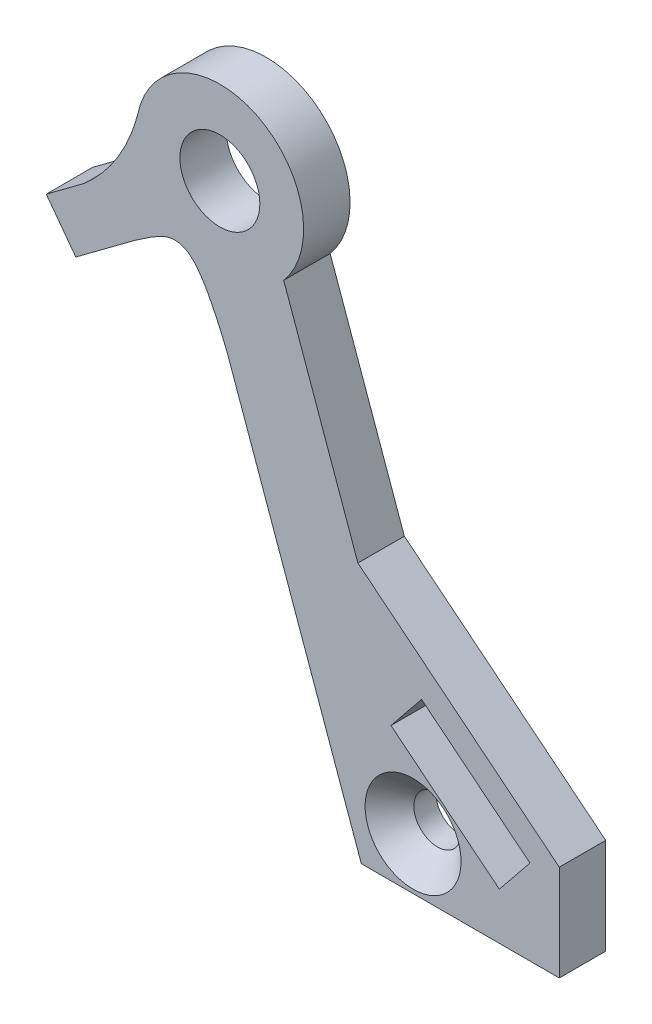
ISO-10303-21;
HEADER;
FILE_DESCRIPTION(('STEP AP214'),'2;1');
FILE_NAME('part.step','',(''),(''),'','','');
FILE_SCHEMA(('AUTOMOTIVE_DESIGN { 1 0 10303 214 1 1 1 1 }'));
ENDSEC;
DATA;
#1=APPLICATION_CONTEXT('core data for automotive mechanical design processes');
#2=APPLICATION_PROTOCOL_DEFINITION('international standard','automotive_design',2000,#1);
#3=PRODUCT_CONTEXT('',#1,'mechanical');
#4=PRODUCT('Part','Part','',(#3));
#5=PRODUCT_RELATED_PRODUCT_CATEGORY('part','',(#4));
#6=PRODUCT_DEFINITION_FORMATION('','',#4);
#7=PRODUCT_DEFINITION_CONTEXT('part definition',#1,'design');
#8=PRODUCT_DEFINITION('design','',#6,#7);
#9=PRODUCT_DEFINITION_SHAPE('','',#8);
#10=(LENGTH_UNIT() NAMED_UNIT(*) SI_UNIT(.MILLI.,.METRE.));
#11=(NAMED_UNIT(*) PLANE_ANGLE_UNIT() SI_UNIT($,.RADIAN.));
#12=(NAMED_UNIT(*) SI_UNIT($,.STERADIAN.) SOLID_ANGLE_UNIT());
#13=UNCERTAINTY_MEASURE_WITH_UNIT(LENGTH_MEASURE(1.E-05),#10,'distance_accuracy_value','');
#14=(GEOMETRIC_REPRESENTATION_CONTEXT(3) GLOBAL_UNCERTAINTY_ASSIGNED_CONTEXT((#13)) GLOBAL_UNIT_ASSIGNED_CONTEXT((#10,
#11,#12)) REPRESENTATION_CONTEXT('',''));
#15=CARTESIAN_POINT('',(0.,0.,0.));
#16=DIRECTION('',(0.,0.,1.));
#17=DIRECTION('',(1.,0.,0.));
#18=AXIS2_PLACEMENT_3D('',#15,#16,#17);
#19=CARTESIAN_POINT('',(7.09605122151095,8.7855872266326,3.05));
#20=DIRECTION('',(0.628337107087621,0.777941180203721,0.));
#21=DIRECTION('',(-0.777941180203721,0.628337107087621,0.));
#22=AXIS2_PLACEMENT_3D('',#19,#20,#21);
#23=PLANE('',#22);
#24=DIRECTION('',(0.777941180203722,-0.628337107087621,0.));
#25=VECTOR('',#24,1.);
#26=CARTESIAN_POINT('',(7.09605122151095,8.7855872266326,0.));
#27=LINE('',#26,#25);
#28=CARTESIAN_POINT('',(3.95568575976615,11.3220362534265,0.));
#29=VERTEX_POINT('',#28);
#30=CARTESIAN_POINT('',(11.0738475586302,5.57275172357473,0.));
#31=VERTEX_POINT('',#30);
#32=EDGE_CURVE('E250',#29,#31,#27,.T.);
#33=ORIENTED_EDGE('',*,*,#32,.T.);
#34=DIRECTION('',(0.,0.,-1.));
#35=VECTOR('',#34,1.);
#36=CARTESIAN_POINT('',(11.0738475586302,5.57275172357473,3.05));
#37=LINE('',#36,#35);
#38=CARTESIAN_POINT('',(11.0738475586302,5.57275172357473,3.05));
#39=VERTEX_POINT('',#38);
#40=EDGE_CURVE('E11',#39,#31,#37,.T.);
#41=ORIENTED_EDGE('',*,*,#40,.F.);
#42=DIRECTION('',(0.777941180203722,-0.628337107087621,0.));
#43=VECTOR('',#42,1.);
#44=CARTESIAN_POINT('',(7.09605122151095,8.7855872266326,3.05));
#45=LINE('',#44,#43);
#46=CARTESIAN_POINT('',(3.95568575976615,11.3220362534265,3.05));
#47=VERTEX_POINT('',#46);
#48=EDGE_CURVE('E180',#47,#39,#45,.T.);
#49=ORIENTED_EDGE('',*,*,#48,.F.);
#50=DIRECTION('',(0.,0.,-1.));
#51=VECTOR('',#50,1.);
#52=CARTESIAN_POINT('',(3.95568575976615,11.3220362534265,3.05));
#53=LINE('',#52,#51);
#54=EDGE_CURVE('E261',#47,#29,#53,.T.);
#55=ORIENTED_EDGE('',*,*,#54,.T.);
#56=EDGE_LOOP('',(#33,#41,#49,#55));
#57=FACE_BOUND('',#56,.T.);
#58=ADVANCED_FACE('F45',(#57),#23,.F.);
#59=CARTESIAN_POINT('',(3.97779633711926,-3.21283550305786,3.05));
#60=DIRECTION('',(-0.777941180203721,0.628337107087621,0.));
#61=DIRECTION('',(-0.628337107087621,-0.777941180203721,0.));
#62=AXIS2_PLACEMENT_3D('',#59,#60,#61);
#63=PLANE('',#62);
#64=DIRECTION('',(0.628337107087621,0.777941180203721,0.));
#65=VECTOR('',#64,1.);
#66=CARTESIAN_POINT('',(3.97779633711926,-3.21283550305786,0.));
#67=LINE('',#66,#65);
#68=CARTESIAN_POINT('',(9.06316881594982,3.08333994692283,0.));
#69=VERTEX_POINT('',#68);
#70=EDGE_CURVE('E170',#69,#31,#67,.T.);
#71=ORIENTED_EDGE('',*,*,#70,.F.);
#72=DIRECTION('',(0.,0.,-1.));
#73=VECTOR('',#72,1.);
#74=CARTESIAN_POINT('',(9.06316881594982,3.08333994692283,3.05));
#75=LINE('',#74,#73);
#76=CARTESIAN_POINT('',(9.06316881594982,3.08333994692283,3.05));
#77=VERTEX_POINT('',#76);
#78=EDGE_CURVE('E56',#77,#69,#75,.T.);
#79=ORIENTED_EDGE('',*,*,#78,.F.);
#80=DIRECTION('',(0.628337107087621,0.777941180203721,0.));
#81=VECTOR('',#80,1.);
#82=CARTESIAN_POINT('',(3.97779633711926,-3.21283550305786,3.05));
#83=LINE('',#82,#81);
#84=EDGE_CURVE('E168',#77,#39,#83,.T.);
#85=ORIENTED_EDGE('',*,*,#84,.T.);
#86=ORIENTED_EDGE('',*,*,#40,.T.);
#87=EDGE_LOOP('',(#71,#79,#85,#86));
#88=FACE_BOUND('',#87,.T.);
#89=ADVANCED_FACE('F166',(#88),#63,.T.);
#90=CARTESIAN_POINT('',(5.08537247883056,6.29617544998069,3.05));
#91=DIRECTION('',(-0.628337107087621,-0.777941180203721,0.));
#92=DIRECTION('',(0.777941180203722,-0.628337107087621,0.));
#93=AXIS2_PLACEMENT_3D('',#90,#91,#92);
#94=PLANE('',#93);
#95=DIRECTION('',(-0.777941180203722,0.628337107087621,0.));
#96=VECTOR('',#95,1.);
#97=CARTESIAN_POINT('',(5.08537247883056,6.29617544998069,0.));
#98=LINE('',#97,#96);
#99=CARTESIAN_POINT('',(1.94500701708577,8.83262447677456,0.));
#100=VERTEX_POINT('',#99);
#101=EDGE_CURVE('E113',#69,#100,#98,.T.);
#102=ORIENTED_EDGE('',*,*,#101,.T.);
#103=DIRECTION('',(0.,0.,-1.));
#104=VECTOR('',#103,1.);
#105=CARTESIAN_POINT('',(1.94500701708577,8.83262447677456,3.05));
#106=LINE('',#105,#104);
#107=CARTESIAN_POINT('',(1.94500701708577,8.83262447677456,3.05));
#108=VERTEX_POINT('',#107);
#109=EDGE_CURVE('E172',#108,#100,#106,.T.);
#110=ORIENTED_EDGE('',*,*,#109,.F.);
#111=DIRECTION('',(-0.777941180203722,0.628337107087621,0.));
#112=VECTOR('',#111,1.);
#113=CARTESIAN_POINT('',(5.08537247883056,6.29617544998069,3.05));
#114=LINE('',#113,#112);
#115=EDGE_CURVE('E174',#77,#108,#114,.T.);
#116=ORIENTED_EDGE('',*,*,#115,.F.);
#117=ORIENTED_EDGE('',*,*,#78,.T.);
#118=EDGE_LOOP('',(#102,#110,#116,#117));
#119=FACE_BOUND('',#118,.T.);
#120=ADVANCED_FACE('F175',(#119),#94,.F.);
#121=CARTESIAN_POINT('',(-9.28819898034565,34.1898082734565,3.05));
#122=DIRECTION('',(0.,0.,-1.));
#123=DIRECTION('',(-1.,0.,0.));
#124=AXIS2_PLACEMENT_3D('',#121,#122,#123);
#125=CYLINDRICAL_SURFACE('',#124,5.5);
#126=CARTESIAN_POINT('',(-9.28819898034565,34.1898082734565,0.));
#127=DIRECTION('',(0.,0.,1.));
#128=DIRECTION('',(1.,0.,0.));
#129=AXIS2_PLACEMENT_3D('',#126,#127,#128);
#130=CIRCLE('',#129,5.5);
#131=CARTESIAN_POINT('',(-5.09661231487709,30.6288250909821,0.));
#132=VERTEX_POINT('',#131);
#133=CARTESIAN_POINT('',(-14.6691492827131,35.3279531866604,0.));
#134=VERTEX_POINT('',#133);
#135=EDGE_CURVE('E196',#132,#134,#130,.T.);
#136=ORIENTED_EDGE('',*,*,#135,.T.);
#137=DIRECTION('',(0.,0.,-1.));
#138=VECTOR('',#137,1.);
#139=CARTESIAN_POINT('',(-14.6691492827131,35.3279531866604,3.05));
#140=LINE('',#139,#138);
#141=CARTESIAN_POINT('',(-14.6691492827131,35.3279531866604,3.05));
#142=VERTEX_POINT('',#141);
#143=EDGE_CURVE('E49',#142,#134,#140,.T.);
#144=ORIENTED_EDGE('',*,*,#143,.F.);
#145=CARTESIAN_POINT('',(-9.28819898034565,34.1898082734565,3.05));
#146=DIRECTION('',(0.,0.,1.));
#147=DIRECTION('',(1.,0.,0.));
#148=AXIS2_PLACEMENT_3D('',#145,#146,#147);
#149=CIRCLE('',#148,5.5);
#150=CARTESIAN_POINT('',(-5.09661231487709,30.6288250909821,3.05));
#151=VERTEX_POINT('',#150);
#152=EDGE_CURVE('E128',#151,#142,#149,.T.);
#153=ORIENTED_EDGE('',*,*,#152,.F.);
#154=DIRECTION('',(0.,0.,-1.));
#155=VECTOR('',#154,1.);
#156=CARTESIAN_POINT('',(-5.09661231487709,30.6288250909821,3.05));
#157=LINE('',#156,#155);
#158=EDGE_CURVE('E191',#151,#132,#157,.T.);
#159=ORIENTED_EDGE('',*,*,#158,.T.);
#160=EDGE_LOOP('',(#136,#144,#153,#159));
#161=FACE_BOUND('',#160,.T.);
#162=ADVANCED_FACE('F305',(#161),#125,.T.);
#163=CARTESIAN_POINT('',(-18.2360742486272,29.5577827751236,3.05));
#164=CARTESIAN_POINT('',(-15.5696456799259,31.8604273669941,3.05));
#165=CARTESIAN_POINT('',(-14.6691492827131,35.3279531866604,3.05));
#166=B_SPLINE_CURVE_WITH_KNOTS('',2,(#163,#164,#165),.UNSPECIFIED.,.F.,.F.,(3,3),(0.,1.),.UNSPECIFIED.);
#167=DIRECTION('',(0.,0.,-1.));
#168=VECTOR('',#167,1.);
#169=SURFACE_OF_LINEAR_EXTRUSION('',#166,#168);
#170=CARTESIAN_POINT('',(-18.2360742486272,29.5577827751236,0.));
#171=CARTESIAN_POINT('',(-15.5696456799259,31.8604273669941,0.));
#172=CARTESIAN_POINT('',(-14.6691492827131,35.3279531866604,0.));
#173=B_SPLINE_CURVE_WITH_KNOTS('',2,(#170,#171,#172),.UNSPECIFIED.,.F.,.F.,(3,3),(0.,1.),.UNSPECIFIED.);
#174=CARTESIAN_POINT('',(-18.2360742486272,29.5577827751236,0.));
#175=VERTEX_POINT('',#174);
#176=EDGE_CURVE('E201',#175,#134,#173,.T.);
#177=ORIENTED_EDGE('',*,*,#176,.F.);
#178=DIRECTION('',(0.,0.,-1.));
#179=VECTOR('',#178,1.);
#180=CARTESIAN_POINT('',(-18.2360742486272,29.5577827751236,3.05));
#181=LINE('',#180,#179);
#182=CARTESIAN_POINT('',(-18.2360742486272,29.5577827751236,3.05));
#183=VERTEX_POINT('',#182);
#184=EDGE_CURVE('E292',#183,#175,#181,.T.);
#185=ORIENTED_EDGE('',*,*,#184,.F.);
#186=EDGE_CURVE('E302',#183,#142,#166,.T.);
#187=ORIENTED_EDGE('',*,*,#186,.T.);
#188=ORIENTED_EDGE('',*,*,#143,.T.);
#189=EDGE_LOOP('',(#177,#185,#187,#188));
#190=FACE_BOUND('',#189,.T.);
#191=ADVANCED_FACE('F301',(#190),#169,.T.);
#192=CARTESIAN_POINT('',(-20.6535504567381,27.759113411979,3.05));
#193=DIRECTION('',(-0.596929027161298,0.80229404617775,0.));
#194=DIRECTION('',(-0.802294046177751,-0.596929027161298,0.));
#195=AXIS2_PLACEMENT_3D('',#192,#193,#194);
#196=PLANE('',#195);
#197=DIRECTION('',(0.802294046177751,0.596929027161298,0.));
#198=VECTOR('',#197,1.);
#199=CARTESIAN_POINT('',(-20.6535504567381,27.759113411979,0.));
#200=LINE('',#199,#198);
#201=CARTESIAN_POINT('',(-20.6880312497935,27.7334587453984,0.));
#202=VERTEX_POINT('',#201);
#203=EDGE_CURVE('E207',#202,#175,#200,.T.);
#204=ORIENTED_EDGE('',*,*,#203,.F.);
#205=DIRECTION('',(0.,0.,-1.));
#206=VECTOR('',#205,1.);
#207=CARTESIAN_POINT('',(-20.6880312497935,27.7334587453984,3.05));
#208=LINE('',#207,#206);
#209=CARTESIAN_POINT('',(-20.6880312497935,27.7334587453984,3.05));
#210=VERTEX_POINT('',#209);
#211=EDGE_CURVE('E290',#210,#202,#208,.T.);
#212=ORIENTED_EDGE('',*,*,#211,.F.);
#213=DIRECTION('',(0.802294046177751,0.596929027161298,0.));
#214=VECTOR('',#213,1.);
#215=CARTESIAN_POINT('',(-20.6535504567381,27.759113411979,3.05));
#216=LINE('',#215,#214);
#217=EDGE_CURVE('E314',#210,#183,#216,.T.);
#218=ORIENTED_EDGE('',*,*,#217,.T.);
#219=ORIENTED_EDGE('',*,*,#184,.T.);
#220=EDGE_LOOP('',(#204,#212,#218,#219));
#221=FACE_BOUND('',#220,.T.);
#222=ADVANCED_FACE('F312',(#221),#196,.T.);
#223=CARTESIAN_POINT('',(-0.0344807930552282,-0.0256546665804964,3.05));
#224=DIRECTION('',(-0.802294046177748,-0.596929027161301,0.));
#225=DIRECTION('',(0.596929027161301,-0.802294046177748,0.));
#226=AXIS2_PLACEMENT_3D('',#223,#224,#225);
#227=PLANE('',#226);
#228=DIRECTION('',(-0.596929027161301,0.802294046177748,0.));
#229=VECTOR('',#228,1.);
#230=CARTESIAN_POINT('',(-0.0344807930552282,-0.0256546665804964,0.));
#231=LINE('',#230,#229);
#232=CARTESIAN_POINT('',(-18.7480119115192,25.1260030953207,0.));
#233=VERTEX_POINT('',#232);
#234=EDGE_CURVE('E214',#233,#202,#231,.T.);
#235=ORIENTED_EDGE('',*,*,#234,.F.);
#236=DIRECTION('',(0.,0.,-1.));
#237=VECTOR('',#236,1.);
#238=CARTESIAN_POINT('',(-18.7480119115192,25.1260030953207,3.05));
#239=LINE('',#238,#237);
#240=CARTESIAN_POINT('',(-18.7480119115192,25.1260030953207,3.05));
#241=VERTEX_POINT('',#240);
#242=EDGE_CURVE('E287',#241,#233,#239,.T.);
#243=ORIENTED_EDGE('',*,*,#242,.F.);
#244=DIRECTION('',(-0.596929027161301,0.802294046177748,0.));
#245=VECTOR('',#244,1.);
#246=CARTESIAN_POINT('',(-0.0344807930552282,-0.0256546665804964,3.05));
#247=LINE('',#246,#245);
#248=EDGE_CURVE('E318',#241,#210,#247,.T.);
#249=ORIENTED_EDGE('',*,*,#248,.T.);
#250=ORIENTED_EDGE('',*,*,#211,.T.);
#251=EDGE_LOOP('',(#235,#243,#249,#250));
#252=FACE_BOUND('',#251,.T.);
#253=ADVANCED_FACE('F321',(#252),#227,.T.);
#254=CARTESIAN_POINT('',(-18.7135311184639,25.1516577619013,3.05));
#255=DIRECTION('',(-0.596929027161297,0.802294046177751,0.));
#256=DIRECTION('',(-0.802294046177751,-0.596929027161297,0.));
#257=AXIS2_PLACEMENT_3D('',#254,#255,#256);
#258=PLANE('',#257);
#259=DIRECTION('',(0.802294046177751,0.596929027161297,0.));
#260=VECTOR('',#259,1.);
#261=CARTESIAN_POINT('',(-18.7135311184639,25.1516577619013,0.));
#262=LINE('',#261,#260);
#263=CARTESIAN_POINT('',(-14.8726582557819,28.0093737231426,0.));
#264=VERTEX_POINT('',#263);
#265=EDGE_CURVE('E218',#233,#264,#262,.T.);
#266=ORIENTED_EDGE('',*,*,#265,.T.);
#267=DIRECTION('',(0.,0.,-1.));
#268=VECTOR('',#267,1.);
#269=CARTESIAN_POINT('',(-14.8726582557819,28.0093737231426,3.05));
#270=LINE('',#269,#268);
#271=CARTESIAN_POINT('',(-14.8726582557819,28.0093737231426,3.05));
#272=VERTEX_POINT('',#271);
#273=EDGE_CURVE('E283',#272,#264,#270,.T.);
#274=ORIENTED_EDGE('',*,*,#273,.F.);
#275=DIRECTION('',(0.802294046177751,0.596929027161297,0.));
#276=VECTOR('',#275,1.);
#277=CARTESIAN_POINT('',(-18.7135311184639,25.1516577619013,3.05));
#278=LINE('',#277,#276);
#279=EDGE_CURVE('E324',#241,#272,#278,.T.);
#280=ORIENTED_EDGE('',*,*,#279,.F.);
#281=ORIENTED_EDGE('',*,*,#242,.T.);
#282=EDGE_LOOP('',(#266,#274,#280,#281));
#283=FACE_BOUND('',#282,.T.);
#284=ADVANCED_FACE('F347',(#283),#258,.F.);
#285=CARTESIAN_POINT('',(-14.8726582557819,28.0093737231426,3.05));
#286=CARTESIAN_POINT('',(-13.3214134816667,29.0873547516752,3.05));
#287=CARTESIAN_POINT('',(-12.0342183780938,29.8700560895985,3.05));
#288=CARTESIAN_POINT('',(-10.3244646558211,28.4083174886022,3.05));
#289=CARTESIAN_POINT('',(-8.80336036255387,24.6542363425028,3.05));
#290=B_SPLINE_CURVE_WITH_KNOTS('',3,(#285,#286,#287,#288,#289),.UNSPECIFIED.,.F.,.F.,(4,1,4),
(0.,0.517103648010991,1.),.UNSPECIFIED.);
#291=DIRECTION('',(0.,0.,-1.));
#292=VECTOR('',#291,1.);
#293=SURFACE_OF_LINEAR_EXTRUSION('',#290,#292);
#294=CARTESIAN_POINT('',(-14.8726582557819,28.0093737231426,0.));
#295=CARTESIAN_POINT('',(-13.3214134816667,29.0873547516752,0.));
#296=CARTESIAN_POINT('',(-12.0342183780938,29.8700560895985,0.));
#297=CARTESIAN_POINT('',(-10.3244646558211,28.4083174886022,0.));
#298=CARTESIAN_POINT('',(-8.80336036255387,24.6542363425028,0.));
#299=B_SPLINE_CURVE_WITH_KNOTS('',3,(#294,#295,#296,#297,#298),.UNSPECIFIED.,.F.,.F.,(4,1,4),
(0.,0.517103648010991,1.),.UNSPECIFIED.);
#300=CARTESIAN_POINT('',(-8.80336036255389,24.6542363425028,0.));
#301=VERTEX_POINT('',#300);
#302=EDGE_CURVE('E221',#264,#301,#299,.T.);
#303=ORIENTED_EDGE('',*,*,#302,.T.);
#304=DIRECTION('',(0.,0.,-1.));
#305=VECTOR('',#304,1.);
#306=CARTESIAN_POINT('',(-8.80336036255389,24.6542363425028,3.05));
#307=LINE('',#306,#305);
#308=CARTESIAN_POINT('',(-8.80336036255389,24.6542363425028,3.05));
#309=VERTEX_POINT('',#308);
#310=EDGE_CURVE('E280',#309,#301,#307,.T.);
#311=ORIENTED_EDGE('',*,*,#310,.F.);
#312=EDGE_CURVE('E327',#272,#309,#290,.T.);
#313=ORIENTED_EDGE('',*,*,#312,.F.);
#314=ORIENTED_EDGE('',*,*,#273,.T.);
#315=EDGE_LOOP('',(#303,#311,#313,#314));
#316=FACE_BOUND('',#315,.T.);
#317=ADVANCED_FACE('F342',(#316),#293,.F.);
#318=CARTESIAN_POINT('',(0.,0.,3.05));
#319=DIRECTION('',(-0.941762769310242,-0.33627798967685,0.));
#320=DIRECTION('',(0.33627798967685,-0.941762769310242,0.));
#321=AXIS2_PLACEMENT_3D('',#318,#319,#320);
#322=PLANE('',#321);
#323=DIRECTION('',(-0.33627798967685,0.941762769310242,0.));
#324=VECTOR('',#323,1.);
#325=CARTESIAN_POINT('',(0.,0.,0.));
#326=LINE('',#325,#324);
#327=CARTESIAN_POINT('',(0.,0.,0.));
#328=VERTEX_POINT('',#327);
#329=EDGE_CURVE('E227',#328,#301,#326,.T.);
#330=ORIENTED_EDGE('',*,*,#329,.F.);
#331=DIRECTION('',(0.,0.,-1.));
#332=VECTOR('',#331,1.);
#333=CARTESIAN_POINT('',(0.,0.,3.05));
#334=LINE('',#333,#332);
#335=CARTESIAN_POINT('',(0.,0.,3.05));
#336=VERTEX_POINT('',#335);
#337=EDGE_CURVE('E277',#336,#328,#334,.T.);
#338=ORIENTED_EDGE('',*,*,#337,.F.);
#339=DIRECTION('',(-0.33627798967685,0.941762769310242,0.));
#340=VECTOR('',#339,1.);
#341=CARTESIAN_POINT('',(0.,0.,3.05));
#342=LINE('',#341,#340);
#343=EDGE_CURVE('E336',#336,#309,#342,.T.);
#344=ORIENTED_EDGE('',*,*,#343,.T.);
#345=ORIENTED_EDGE('',*,*,#310,.T.);
#346=EDGE_LOOP('',(#330,#338,#344,#345));
#347=FACE_BOUND('',#346,.T.);
#348=ADVANCED_FACE('F346',(#347),#322,.T.);
#349=CARTESIAN_POINT('',(0.,0.,3.05));
#350=DIRECTION('',(0.,1.,0.));
#351=DIRECTION('',(-1.,0.,0.));
#352=AXIS2_PLACEMENT_3D('',#349,#350,#351);
#353=PLANE('',#352);
#354=DIRECTION('',(1.,0.,0.));
#355=VECTOR('',#354,1.);
#356=CARTESIAN_POINT('',(0.,0.,0.));
#357=LINE('',#356,#355);
#358=CARTESIAN_POINT('',(13.,0.,0.));
#359=VERTEX_POINT('',#358);
#360=EDGE_CURVE('E234',#328,#359,#357,.T.);
#361=ORIENTED_EDGE('',*,*,#360,.T.);
#362=DIRECTION('',(0.,0.,-1.));
#363=VECTOR('',#362,1.);
#364=CARTESIAN_POINT('',(13.,0.,3.05));
#365=LINE('',#364,#363);
#366=CARTESIAN_POINT('',(13.,0.,3.05));
#367=VERTEX_POINT('',#366);
#368=EDGE_CURVE('E274',#367,#359,#365,.T.);
#369=ORIENTED_EDGE('',*,*,#368,.F.);
#370=DIRECTION('',(1.,0.,0.));
#371=VECTOR('',#370,1.);
#372=CARTESIAN_POINT('',(0.,0.,3.05));
#373=LINE('',#372,#371);
#374=EDGE_CURVE('E445',#336,#367,#373,.T.);
#375=ORIENTED_EDGE('',*,*,#374,.F.);
#376=ORIENTED_EDGE('',*,*,#337,.T.);
#377=EDGE_LOOP('',(#361,#369,#375,#376));
#378=FACE_BOUND('',#377,.T.);
#379=ADVANCED_FACE('F424',(#378),#353,.F.);
#380=CARTESIAN_POINT('',(13.,0.,3.05));
#381=DIRECTION('',(1.,0.,0.));
#382=DIRECTION('',(0.,0.,-1.));
#383=AXIS2_PLACEMENT_3D('',#380,#381,#382);
#384=PLANE('',#383);
#385=DIRECTION('',(0.,-1.,0.));
#386=VECTOR('',#385,1.);
#387=CARTESIAN_POINT('',(13.,0.,0.));
#388=LINE('',#387,#386);
#389=CARTESIAN_POINT('',(13.,6.3039086153561,0.));
#390=VERTEX_POINT('',#389);
#391=EDGE_CURVE('E238',#390,#359,#388,.T.);
#392=ORIENTED_EDGE('',*,*,#391,.F.);
#393=DIRECTION('',(0.,0.,-1.));
#394=VECTOR('',#393,1.);
#395=CARTESIAN_POINT('',(13.,6.3039086153561,3.05));
#396=LINE('',#395,#394);
#397=CARTESIAN_POINT('',(13.,6.3039086153561,3.05));
#398=VERTEX_POINT('',#397);
#399=EDGE_CURVE('E271',#398,#390,#396,.T.);
#400=ORIENTED_EDGE('',*,*,#399,.F.);
#401=DIRECTION('',(0.,-1.,0.));
#402=VECTOR('',#401,1.);
#403=CARTESIAN_POINT('',(13.,0.,3.05));
#404=LINE('',#403,#402);
#405=EDGE_CURVE('E440',#398,#367,#404,.T.);
#406=ORIENTED_EDGE('',*,*,#405,.T.);
#407=ORIENTED_EDGE('',*,*,#368,.T.);
#408=EDGE_LOOP('',(#392,#400,#406,#407));
#409=FACE_BOUND('',#408,.T.);
#410=ADVANCED_FACE('F421',(#409),#384,.T.);
#411=CARTESIAN_POINT('',(8.21390698655723,10.1695991262137,3.05));
#412=DIRECTION('',(0.628337107087621,0.777941180203721,0.));
#413=DIRECTION('',(-0.777941180203722,0.628337107087621,0.));
#414=AXIS2_PLACEMENT_3D('',#411,#412,#413);
#415=PLANE('',#414);
#416=DIRECTION('',(0.777941180203722,-0.628337107087621,0.));
#417=VECTOR('',#416,1.);
#418=CARTESIAN_POINT('',(8.21390698655723,10.1695991262137,0.));
#419=LINE('',#418,#417);
#420=CARTESIAN_POINT('',(-0.225000063463268,16.9856394358457,0.));
#421=VERTEX_POINT('',#420);
#422=EDGE_CURVE('E242',#421,#390,#419,.T.);
#423=ORIENTED_EDGE('',*,*,#422,.F.);
#424=DIRECTION('',(0.,0.,-1.));
#425=VECTOR('',#424,1.);
#426=CARTESIAN_POINT('',(-0.225000063463268,16.9856394358457,3.05));
#427=LINE('',#426,#425);
#428=CARTESIAN_POINT('',(-0.225000063463268,16.9856394358457,3.05));
#429=VERTEX_POINT('',#428);
#430=EDGE_CURVE('E268',#429,#421,#427,.T.);
#431=ORIENTED_EDGE('',*,*,#430,.F.);
#432=DIRECTION('',(0.777941180203722,-0.628337107087621,0.));
#433=VECTOR('',#432,1.);
#434=CARTESIAN_POINT('',(8.21390698655723,10.1695991262137,3.05));
#435=LINE('',#434,#433);
#436=EDGE_CURVE('E444',#429,#398,#435,.T.);
#437=ORIENTED_EDGE('',*,*,#436,.T.);
#438=ORIENTED_EDGE('',*,*,#399,.T.);
#439=EDGE_LOOP('',(#423,#431,#437,#438));
#440=FACE_BOUND('',#439,.T.);
#441=ADVANCED_FACE('F418',(#440),#415,.T.);
#442=CARTESIAN_POINT('',(-3.14036546174479,2.53644902679387,3.05));
#443=DIRECTION('',(-0.777941180203721,0.628337107087621,0.));
#444=DIRECTION('',(-0.628337107087621,-0.777941180203721,0.));
#445=AXIS2_PLACEMENT_3D('',#442,#443,#444);
#446=PLANE('',#445);
#447=DIRECTION('',(0.628337107087621,0.777941180203721,0.));
#448=VECTOR('',#447,1.);
#449=CARTESIAN_POINT('',(-3.14036546174479,2.53644902679387,0.));
#450=LINE('',#449,#448);
#451=EDGE_CURVE('E119',#100,#29,#450,.T.);
#452=ORIENTED_EDGE('',*,*,#451,.T.);
#453=ORIENTED_EDGE('',*,*,#54,.F.);
#454=DIRECTION('',(0.628337107087621,0.777941180203721,0.));
#455=VECTOR('',#454,1.);
#456=CARTESIAN_POINT('',(-3.14036546174479,2.53644902679387,3.05));
#457=LINE('',#456,#455);
#458=EDGE_CURVE('E65',#108,#47,#457,.T.);
#459=ORIENTED_EDGE('',*,*,#458,.F.);
#460=ORIENTED_EDGE('',*,*,#109,.T.);
#461=EDGE_LOOP('',(#452,#453,#459,#460));
#462=FACE_BOUND('',#461,.T.);
#463=ADVANCED_FACE('F416',(#462),#446,.F.);
#464=CARTESIAN_POINT('',(5.17969523120609,1.84952894322254,3.05));
#465=DIRECTION('',(0.941762769310245,0.336277989676842,0.));
#466=DIRECTION('',(-0.336277989676842,0.941762769310245,0.));
#467=AXIS2_PLACEMENT_3D('',#464,#465,#466);
#468=PLANE('',#467);
#469=DIRECTION('',(0.336277989676842,-0.941762769310245,0.));
#470=VECTOR('',#469,1.);
#471=CARTESIAN_POINT('',(5.17969523120609,1.84952894322254,0.));
#472=LINE('',#471,#470);
#473=EDGE_CURVE('E246',#132,#421,#472,.T.);
#474=ORIENTED_EDGE('',*,*,#473,.F.);
#475=ORIENTED_EDGE('',*,*,#158,.F.);
#476=DIRECTION('',(0.336277989676842,-0.941762769310245,0.));
#477=VECTOR('',#476,1.);
#478=CARTESIAN_POINT('',(5.17969523120609,1.84952894322254,3.05));
#479=LINE('',#478,#477);
#480=EDGE_CURVE('E185',#151,#429,#479,.T.);
#481=ORIENTED_EDGE('',*,*,#480,.T.);
#482=ORIENTED_EDGE('',*,*,#430,.T.);
#483=EDGE_LOOP('',(#474,#475,#481,#482));
#484=FACE_BOUND('',#483,.T.);
#485=ADVANCED_FACE('F392',(#484),#468,.T.);
#486=CARTESIAN_POINT('',(-9.28819898034565,34.1898082734565,3.05));
#487=DIRECTION('',(0.,0.,-1.));
#488=DIRECTION('',(-1.,0.,0.));
#489=AXIS2_PLACEMENT_3D('',#486,#487,#488);
#490=CYLINDRICAL_SURFACE('',#489,2.625);
#491=CARTESIAN_POINT('',(-9.28819898034565,34.1898082734565,3.05));
#492=DIRECTION('',(0.,0.,1.));
#493=DIRECTION('',(1.,0.,0.));
#494=AXIS2_PLACEMENT_3D('',#491,#492,#493);
#495=CIRCLE('',#494,2.625);
#496=CARTESIAN_POINT('',(-6.66319898034565,34.1898082734565,3.05));
#497=VERTEX_POINT('',#496);
#498=EDGE_CURVE('E260',#497,#497,#495,.T.);
#499=ORIENTED_EDGE('',*,*,#498,.T.);
#500=EDGE_LOOP('',(#499));
#501=FACE_BOUND('',#500,.T.);
#502=CARTESIAN_POINT('',(-9.28819898034565,34.1898082734565,0.));
#503=DIRECTION('',(0.,0.,1.));
#504=DIRECTION('',(1.,0.,0.));
#505=AXIS2_PLACEMENT_3D('',#502,#503,#504);
#506=CIRCLE('',#505,2.625);
#507=CARTESIAN_POINT('',(-6.66319898034565,34.1898082734565,0.));
#508=VERTEX_POINT('',#507);
#509=EDGE_CURVE('E192',#508,#508,#506,.T.);
#510=ORIENTED_EDGE('',*,*,#509,.F.);
#511=EDGE_LOOP('',(#510));
#512=FACE_BOUND('',#511,.T.);
#513=ADVANCED_FACE('F47',(#501,#512),#490,.F.);
#514=CARTESIAN_POINT('',(0.,0.,3.05));
#515=DIRECTION('',(0.,0.,1.));
#516=DIRECTION('',(1.,0.,0.));
#517=AXIS2_PLACEMENT_3D('',#514,#515,#516);
#518=PLANE('',#517);
#519=CARTESIAN_POINT('',(3.4,3.4,3.05));
#520=DIRECTION('',(0.,0.,1.));
#521=DIRECTION('',(1.,0.,0.));
#522=AXIS2_PLACEMENT_3D('',#519,#520,#521);
#523=CIRCLE('',#522,3.15);
#524=CARTESIAN_POINT('',(6.55,3.4,3.05));
#525=VERTEX_POINT('',#524);
#526=EDGE_CURVE('E378',#525,#525,#523,.T.);
#527=ORIENTED_EDGE('',*,*,#526,.F.);
#528=EDGE_LOOP('',(#527));
#529=FACE_BOUND('',#528,.T.);
#530=ORIENTED_EDGE('',*,*,#498,.F.);
#531=EDGE_LOOP('',(#530));
#532=FACE_BOUND('',#531,.T.);
#533=ORIENTED_EDGE('',*,*,#152,.T.);
#534=ORIENTED_EDGE('',*,*,#186,.F.);
#535=ORIENTED_EDGE('',*,*,#217,.F.);
#536=ORIENTED_EDGE('',*,*,#248,.F.);
#537=ORIENTED_EDGE('',*,*,#279,.T.);
#538=ORIENTED_EDGE('',*,*,#312,.T.);
#539=ORIENTED_EDGE('',*,*,#343,.F.);
#540=ORIENTED_EDGE('',*,*,#374,.T.);
#541=ORIENTED_EDGE('',*,*,#405,.F.);
#542=ORIENTED_EDGE('',*,*,#436,.F.);
#543=ORIENTED_EDGE('',*,*,#480,.F.);
#544=EDGE_LOOP('',(#533,#534,#535,#536,#537,#538,#539,#540,#541,#542,#543));
#545=FACE_BOUND('',#544,.T.);
#546=ORIENTED_EDGE('',*,*,#48,.T.);
#547=ORIENTED_EDGE('',*,*,#84,.F.);
#548=ORIENTED_EDGE('',*,*,#115,.T.);
#549=ORIENTED_EDGE('',*,*,#458,.T.);
#550=EDGE_LOOP('',(#546,#547,#548,#549));
#551=FACE_BOUND('',#550,.T.);
#552=ADVANCED_FACE('F178',(#529,#532,#545,#551),#518,.T.);
#553=CARTESIAN_POINT('',(0.,0.,0.));
#554=DIRECTION('',(0.,0.,1.));
#555=DIRECTION('',(1.,0.,0.));
#556=AXIS2_PLACEMENT_3D('',#553,#554,#555);
#557=PLANE('',#556);
#558=CARTESIAN_POINT('',(3.4,3.4,0.));
#559=DIRECTION('',(0.,0.,1.));
#560=DIRECTION('',(1.,0.,0.));
#561=AXIS2_PLACEMENT_3D('',#558,#559,#560);
#562=CIRCLE('',#561,1.55);
#563=CARTESIAN_POINT('',(4.95,3.4,0.));
#564=VERTEX_POINT('',#563);
#565=EDGE_CURVE('E197',#564,#564,#562,.T.);
#566=ORIENTED_EDGE('',*,*,#565,.T.);
#567=EDGE_LOOP('',(#566));
#568=FACE_BOUND('',#567,.T.);
#569=ORIENTED_EDGE('',*,*,#509,.T.);
#570=EDGE_LOOP('',(#569));
#571=FACE_BOUND('',#570,.T.);
#572=ORIENTED_EDGE('',*,*,#135,.F.);
#573=ORIENTED_EDGE('',*,*,#473,.T.);
#574=ORIENTED_EDGE('',*,*,#422,.T.);
#575=ORIENTED_EDGE('',*,*,#391,.T.);
#576=ORIENTED_EDGE('',*,*,#360,.F.);
#577=ORIENTED_EDGE('',*,*,#329,.T.);
#578=ORIENTED_EDGE('',*,*,#302,.F.);
#579=ORIENTED_EDGE('',*,*,#265,.F.);
#580=ORIENTED_EDGE('',*,*,#234,.T.);
#581=ORIENTED_EDGE('',*,*,#203,.T.);
#582=ORIENTED_EDGE('',*,*,#176,.T.);
#583=EDGE_LOOP('',(#572,#573,#574,#575,#576,#577,#578,#579,#580,#581,#582));
#584=FACE_BOUND('',#583,.T.);
#585=ORIENTED_EDGE('',*,*,#32,.F.);
#586=ORIENTED_EDGE('',*,*,#451,.F.);
#587=ORIENTED_EDGE('',*,*,#101,.F.);
#588=ORIENTED_EDGE('',*,*,#70,.T.);
#589=EDGE_LOOP('',(#585,#586,#587,#588));
#590=FACE_BOUND('',#589,.T.);
#591=ADVANCED_FACE('F308',(#568,#571,#584,#590),#557,.F.);
#592=CARTESIAN_POINT('',(3.4,3.4,3.05));
#593=DIRECTION('',(0.,0.,1.));
#594=DIRECTION('',(1.,0.,0.));
#595=AXIS2_PLACEMENT_3D('',#592,#593,#594);
#596=CYLINDRICAL_SURFACE('',#595,1.55);
#597=ORIENTED_EDGE('',*,*,#565,.F.);
#598=EDGE_LOOP('',(#597));
#599=FACE_BOUND('',#598,.T.);
#600=CARTESIAN_POINT('',(3.4,3.4,1.45));
#601=DIRECTION('',(0.,0.,1.));
#602=DIRECTION('',(1.,0.,0.));
#603=AXIS2_PLACEMENT_3D('',#600,#601,#602);
#604=CIRCLE('',#603,1.55);
#605=CARTESIAN_POINT('',(4.95,3.4,1.45));
#606=VERTEX_POINT('',#605);
#607=EDGE_CURVE('E374',#606,#606,#604,.T.);
#608=ORIENTED_EDGE('',*,*,#607,.T.);
#609=EDGE_LOOP('',(#608));
#610=FACE_BOUND('',#609,.T.);
#611=ADVANCED_FACE('F396',(#599,#610),#596,.F.);
#612=CARTESIAN_POINT('',(3.4,3.4,3.05));
#613=DIRECTION('',(0.,0.,1.));
#614=DIRECTION('',(1.,0.,0.));
#615=AXIS2_PLACEMENT_3D('',#612,#613,#614);
#616=CONICAL_SURFACE('',#615,3.15,0.785398163397448);
#617=ORIENTED_EDGE('',*,*,#607,.F.);
#618=EDGE_LOOP('',(#617));
#619=FACE_BOUND('',#618,.T.);
#620=ORIENTED_EDGE('',*,*,#526,.T.);
#621=EDGE_LOOP('',(#620));
#622=FACE_BOUND('',#621,.T.);
#623=ADVANCED_FACE('F383',(#619,#622),#616,.F.);
#624=CLOSED_SHELL('',(#58,#89,#120,#162,#191,#222,#253,#284,#317,#348,#379,#410,#441,#463,#485,
#513,#552,#591,#611,#623));
#625=MANIFOLD_SOLID_BREP('B2',#624);
#626=ADVANCED_BREP_SHAPE_REPRESENTATION('',(#18,#625),#14);
#627=SHAPE_DEFINITION_REPRESENTATION(#9,#626);
ENDSEC;
END-ISO-10303-21;
